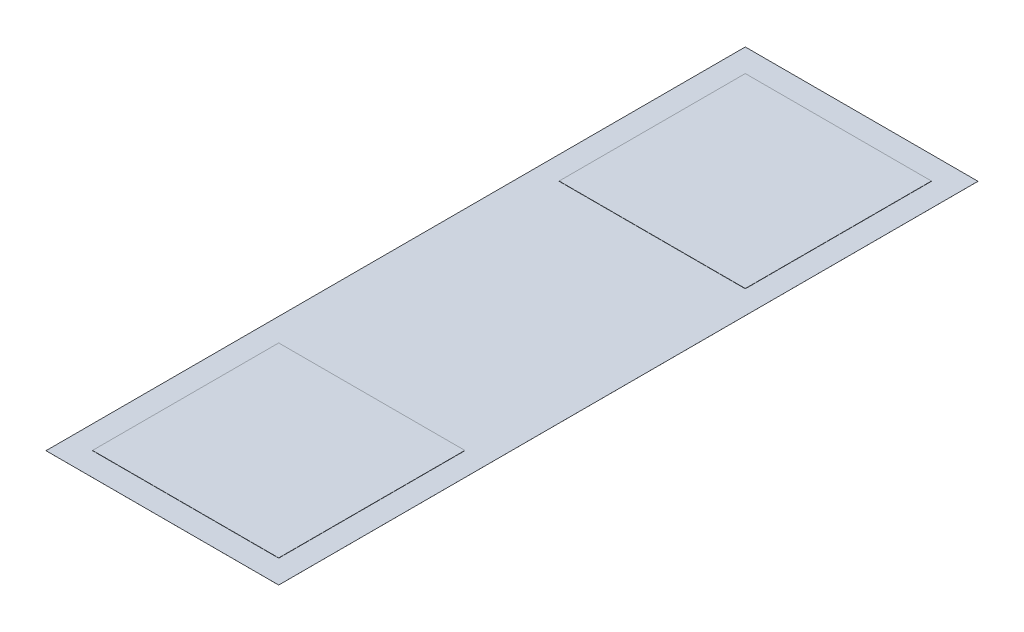
ISO-10303-21;
HEADER;
FILE_DESCRIPTION(('STEP AP214'),'2;1');
FILE_NAME('part.step','',(''),(''),'','','');
FILE_SCHEMA(('AUTOMOTIVE_DESIGN { 1 0 10303 214 1 1 1 1 }'));
ENDSEC;
DATA;
#1=APPLICATION_CONTEXT('core data for automotive mechanical design processes');
#2=APPLICATION_PROTOCOL_DEFINITION('international standard','automotive_design',2000,#1);
#3=PRODUCT_CONTEXT('',#1,'mechanical');
#4=PRODUCT('Part','Part','',(#3));
#5=PRODUCT_RELATED_PRODUCT_CATEGORY('part','',(#4));
#6=PRODUCT_DEFINITION_FORMATION('','',#4);
#7=PRODUCT_DEFINITION_CONTEXT('part definition',#1,'design');
#8=PRODUCT_DEFINITION('design','',#6,#7);
#9=PRODUCT_DEFINITION_SHAPE('','',#8);
#10=(LENGTH_UNIT() NAMED_UNIT(*) SI_UNIT(.MILLI.,.METRE.));
#11=(NAMED_UNIT(*) PLANE_ANGLE_UNIT() SI_UNIT($,.RADIAN.));
#12=(NAMED_UNIT(*) SI_UNIT($,.STERADIAN.) SOLID_ANGLE_UNIT());
#13=UNCERTAINTY_MEASURE_WITH_UNIT(LENGTH_MEASURE(1.E-05),#10,'distance_accuracy_value','');
#14=(GEOMETRIC_REPRESENTATION_CONTEXT(3) GLOBAL_UNCERTAINTY_ASSIGNED_CONTEXT((#13)) GLOBAL_UNIT_ASSIGNED_CONTEXT((#10,
#11,#12)) REPRESENTATION_CONTEXT('',''));
#15=CARTESIAN_POINT('',(0.,0.,0.));
#16=DIRECTION('',(0.,0.,1.));
#17=DIRECTION('',(1.,0.,0.));
#18=AXIS2_PLACEMENT_3D('',#15,#16,#17);
#19=CARTESIAN_POINT('',(0.,0.01,0.));
#20=DIRECTION('',(0.,1.,0.));
#21=DIRECTION('',(0.,0.,1.));
#22=AXIS2_PLACEMENT_3D('',#19,#20,#21);
#23=PLANE('',#22);
#24=DIRECTION('',(0.,0.,-1.));
#25=VECTOR('',#24,1.);
#26=CARTESIAN_POINT('',(50.,0.01,-150.255));
#27=LINE('',#26,#25);
#28=CARTESIAN_POINT('',(50.,0.01,150.255));
#29=VERTEX_POINT('',#28);
#30=CARTESIAN_POINT('',(50.,0.01,-150.255));
#31=VERTEX_POINT('',#30);
#32=EDGE_CURVE('E213',#29,#31,#27,.T.);
#33=ORIENTED_EDGE('',*,*,#32,.T.);
#34=DIRECTION('',(-1.,0.,0.));
#35=VECTOR('',#34,1.);
#36=CARTESIAN_POINT('',(-50.,0.01,-150.255));
#37=LINE('',#36,#35);
#38=CARTESIAN_POINT('',(-50.,0.01,-150.255));
#39=VERTEX_POINT('',#38);
#40=EDGE_CURVE('E217',#31,#39,#37,.T.);
#41=ORIENTED_EDGE('',*,*,#40,.T.);
#42=DIRECTION('',(0.,0.,1.));
#43=VECTOR('',#42,1.);
#44=CARTESIAN_POINT('',(-50.,0.01,-150.255));
#45=LINE('',#44,#43);
#46=CARTESIAN_POINT('',(-50.,0.01,150.255));
#47=VERTEX_POINT('',#46);
#48=EDGE_CURVE('E221',#39,#47,#45,.T.);
#49=ORIENTED_EDGE('',*,*,#48,.T.);
#50=DIRECTION('',(1.,0.,0.));
#51=VECTOR('',#50,1.);
#52=CARTESIAN_POINT('',(-50.,0.01,150.255));
#53=LINE('',#52,#51);
#54=EDGE_CURVE('E224',#47,#29,#53,.T.);
#55=ORIENTED_EDGE('',*,*,#54,.T.);
#56=EDGE_LOOP('',(#33,#41,#49,#55));
#57=FACE_BOUND('',#56,.T.);
#58=DIRECTION('',(1.,0.,0.));
#59=VECTOR('',#58,1.);
#60=CARTESIAN_POINT('',(-40.,0.01,-60.255));
#61=LINE('',#60,#59);
#62=CARTESIAN_POINT('',(-40.,0.01,-60.255));
#63=VERTEX_POINT('',#62);
#64=CARTESIAN_POINT('',(40.,0.01,-60.255));
#65=VERTEX_POINT('',#64);
#66=EDGE_CURVE('E195',#63,#65,#61,.T.);
#67=ORIENTED_EDGE('',*,*,#66,.F.);
#68=DIRECTION('',(0.,0.,1.));
#69=VECTOR('',#68,1.);
#70=CARTESIAN_POINT('',(-40.,0.01,-140.255));
#71=LINE('',#70,#69);
#72=CARTESIAN_POINT('',(-40.,0.01,-140.255));
#73=VERTEX_POINT('',#72);
#74=EDGE_CURVE('E198',#73,#63,#71,.T.);
#75=ORIENTED_EDGE('',*,*,#74,.F.);
#76=DIRECTION('',(-1.,0.,0.));
#77=VECTOR('',#76,1.);
#78=CARTESIAN_POINT('',(-40.,0.01,-140.255));
#79=LINE('',#78,#77);
#80=CARTESIAN_POINT('',(40.,0.01,-140.255));
#81=VERTEX_POINT('',#80);
#82=EDGE_CURVE('E188',#81,#73,#79,.T.);
#83=ORIENTED_EDGE('',*,*,#82,.F.);
#84=DIRECTION('',(0.,0.,-1.));
#85=VECTOR('',#84,1.);
#86=CARTESIAN_POINT('',(40.,0.01,-140.255));
#87=LINE('',#86,#85);
#88=EDGE_CURVE('E191',#65,#81,#87,.T.);
#89=ORIENTED_EDGE('',*,*,#88,.F.);
#90=EDGE_LOOP('',(#67,#75,#83,#89));
#91=FACE_BOUND('',#90,.T.);
#92=DIRECTION('',(1.,0.,0.));
#93=VECTOR('',#92,1.);
#94=CARTESIAN_POINT('',(-40.,0.01,140.255));
#95=LINE('',#94,#93);
#96=CARTESIAN_POINT('',(-40.,0.01,140.255));
#97=VERTEX_POINT('',#96);
#98=CARTESIAN_POINT('',(40.,0.01,140.255));
#99=VERTEX_POINT('',#98);
#100=EDGE_CURVE('E396',#97,#99,#95,.T.);
#101=ORIENTED_EDGE('',*,*,#100,.F.);
#102=DIRECTION('',(0.,0.,1.));
#103=VECTOR('',#102,1.);
#104=CARTESIAN_POINT('',(-40.,0.01,140.255));
#105=LINE('',#104,#103);
#106=CARTESIAN_POINT('',(-40.,0.01,60.255));
#107=VERTEX_POINT('',#106);
#108=EDGE_CURVE('E161',#107,#97,#105,.T.);
#109=ORIENTED_EDGE('',*,*,#108,.F.);
#110=DIRECTION('',(-1.,0.,0.));
#111=VECTOR('',#110,1.);
#112=CARTESIAN_POINT('',(-40.,0.01,60.255));
#113=LINE('',#112,#111);
#114=CARTESIAN_POINT('',(40.,0.01,60.255));
#115=VERTEX_POINT('',#114);
#116=EDGE_CURVE('E157',#115,#107,#113,.T.);
#117=ORIENTED_EDGE('',*,*,#116,.F.);
#118=DIRECTION('',(0.,0.,-1.));
#119=VECTOR('',#118,1.);
#120=CARTESIAN_POINT('',(40.,0.01,140.255));
#121=LINE('',#120,#119);
#122=EDGE_CURVE('E392',#99,#115,#121,.T.);
#123=ORIENTED_EDGE('',*,*,#122,.F.);
#124=EDGE_LOOP('',(#101,#109,#117,#123));
#125=FACE_BOUND('',#124,.T.);
#126=ADVANCED_FACE('F45',(#57,#91,#125),#23,.T.);
#127=CARTESIAN_POINT('',(50.,0.01,-150.255));
#128=DIRECTION('',(-1.,0.,0.));
#129=DIRECTION('',(0.,0.,1.));
#130=AXIS2_PLACEMENT_3D('',#127,#128,#129);
#131=PLANE('',#130);
#132=DIRECTION('',(0.,0.,-1.));
#133=VECTOR('',#132,1.);
#134=CARTESIAN_POINT('',(50.,0.,-150.255));
#135=LINE('',#134,#133);
#136=CARTESIAN_POINT('',(50.,0.,150.255));
#137=VERTEX_POINT('',#136);
#138=CARTESIAN_POINT('',(50.,0.,-150.255));
#139=VERTEX_POINT('',#138);
#140=EDGE_CURVE('E164',#137,#139,#135,.T.);
#141=ORIENTED_EDGE('',*,*,#140,.T.);
#142=DIRECTION('',(0.,-1.,0.));
#143=VECTOR('',#142,1.);
#144=CARTESIAN_POINT('',(50.,0.01,-150.255));
#145=LINE('',#144,#143);
#146=EDGE_CURVE('E11',#31,#139,#145,.T.);
#147=ORIENTED_EDGE('',*,*,#146,.F.);
#148=ORIENTED_EDGE('',*,*,#32,.F.);
#149=DIRECTION('',(0.,-1.,0.));
#150=VECTOR('',#149,1.);
#151=CARTESIAN_POINT('',(50.,0.01,150.255));
#152=LINE('',#151,#150);
#153=EDGE_CURVE('E226',#29,#137,#152,.T.);
#154=ORIENTED_EDGE('',*,*,#153,.T.);
#155=EDGE_LOOP('',(#141,#147,#148,#154));
#156=FACE_BOUND('',#155,.T.);
#157=ADVANCED_FACE('F47',(#156),#131,.F.);
#158=CARTESIAN_POINT('',(-50.,0.01,-150.255));
#159=DIRECTION('',(0.,0.,1.));
#160=DIRECTION('',(1.,0.,0.));
#161=AXIS2_PLACEMENT_3D('',#158,#159,#160);
#162=PLANE('',#161);
#163=DIRECTION('',(-1.,0.,0.));
#164=VECTOR('',#163,1.);
#165=CARTESIAN_POINT('',(-50.,0.,-150.255));
#166=LINE('',#165,#164);
#167=CARTESIAN_POINT('',(-50.,0.,-150.255));
#168=VERTEX_POINT('',#167);
#169=EDGE_CURVE('E169',#139,#168,#166,.T.);
#170=ORIENTED_EDGE('',*,*,#169,.T.);
#171=DIRECTION('',(0.,-1.,0.));
#172=VECTOR('',#171,1.);
#173=CARTESIAN_POINT('',(-50.,0.01,-150.255));
#174=LINE('',#173,#172);
#175=EDGE_CURVE('E54',#39,#168,#174,.T.);
#176=ORIENTED_EDGE('',*,*,#175,.F.);
#177=ORIENTED_EDGE('',*,*,#40,.F.);
#178=ORIENTED_EDGE('',*,*,#146,.T.);
#179=EDGE_LOOP('',(#170,#176,#177,#178));
#180=FACE_BOUND('',#179,.T.);
#181=ADVANCED_FACE('F263',(#180),#162,.F.);
#182=CARTESIAN_POINT('',(-50.,0.01,-150.255));
#183=DIRECTION('',(1.,0.,0.));
#184=DIRECTION('',(0.,0.,-1.));
#185=AXIS2_PLACEMENT_3D('',#182,#183,#184);
#186=PLANE('',#185);
#187=DIRECTION('',(0.,0.,1.));
#188=VECTOR('',#187,1.);
#189=CARTESIAN_POINT('',(-50.,0.,-150.255));
#190=LINE('',#189,#188);
#191=CARTESIAN_POINT('',(-50.,0.,150.255));
#192=VERTEX_POINT('',#191);
#193=EDGE_CURVE('E230',#168,#192,#190,.T.);
#194=ORIENTED_EDGE('',*,*,#193,.T.);
#195=DIRECTION('',(0.,-1.,0.));
#196=VECTOR('',#195,1.);
#197=CARTESIAN_POINT('',(-50.,0.01,150.255));
#198=LINE('',#197,#196);
#199=EDGE_CURVE('E238',#47,#192,#198,.T.);
#200=ORIENTED_EDGE('',*,*,#199,.F.);
#201=ORIENTED_EDGE('',*,*,#48,.F.);
#202=ORIENTED_EDGE('',*,*,#175,.T.);
#203=EDGE_LOOP('',(#194,#200,#201,#202));
#204=FACE_BOUND('',#203,.T.);
#205=ADVANCED_FACE('F247',(#204),#186,.F.);
#206=CARTESIAN_POINT('',(-50.,0.01,150.255));
#207=DIRECTION('',(0.,0.,-1.));
#208=DIRECTION('',(-1.,0.,0.));
#209=AXIS2_PLACEMENT_3D('',#206,#207,#208);
#210=PLANE('',#209);
#211=DIRECTION('',(1.,0.,0.));
#212=VECTOR('',#211,1.);
#213=CARTESIAN_POINT('',(-50.,0.,150.255));
#214=LINE('',#213,#212);
#215=EDGE_CURVE('E218',#192,#137,#214,.T.);
#216=ORIENTED_EDGE('',*,*,#215,.T.);
#217=ORIENTED_EDGE('',*,*,#153,.F.);
#218=ORIENTED_EDGE('',*,*,#54,.F.);
#219=ORIENTED_EDGE('',*,*,#199,.T.);
#220=EDGE_LOOP('',(#216,#217,#218,#219));
#221=FACE_BOUND('',#220,.T.);
#222=ADVANCED_FACE('F256',(#221),#210,.F.);
#223=CARTESIAN_POINT('',(0.,0.,0.));
#224=DIRECTION('',(0.,1.,0.));
#225=DIRECTION('',(0.,0.,1.));
#226=AXIS2_PLACEMENT_3D('',#223,#224,#225);
#227=PLANE('',#226);
#228=ORIENTED_EDGE('',*,*,#140,.F.);
#229=ORIENTED_EDGE('',*,*,#215,.F.);
#230=ORIENTED_EDGE('',*,*,#193,.F.);
#231=ORIENTED_EDGE('',*,*,#169,.F.);
#232=EDGE_LOOP('',(#228,#229,#230,#231));
#233=FACE_BOUND('',#232,.T.);
#234=ADVANCED_FACE('F253',(#233),#227,.F.);
#235=CARTESIAN_POINT('',(-40.,0.11,-140.255));
#236=DIRECTION('',(1.,0.,0.));
#237=DIRECTION('',(0.,0.,-1.));
#238=AXIS2_PLACEMENT_3D('',#235,#236,#237);
#239=PLANE('',#238);
#240=ORIENTED_EDGE('',*,*,#74,.T.);
#241=DIRECTION('',(0.,-1.,0.));
#242=VECTOR('',#241,1.);
#243=CARTESIAN_POINT('',(-40.,0.11,-60.255));
#244=LINE('',#243,#242);
#245=CARTESIAN_POINT('',(-40.,0.11,-60.255));
#246=VERTEX_POINT('',#245);
#247=EDGE_CURVE('E174',#246,#63,#244,.T.);
#248=ORIENTED_EDGE('',*,*,#247,.F.);
#249=DIRECTION('',(0.,0.,1.));
#250=VECTOR('',#249,1.);
#251=CARTESIAN_POINT('',(-40.,0.11,-140.255));
#252=LINE('',#251,#250);
#253=CARTESIAN_POINT('',(-40.,0.11,-140.255));
#254=VERTEX_POINT('',#253);
#255=EDGE_CURVE('E192',#254,#246,#252,.T.);
#256=ORIENTED_EDGE('',*,*,#255,.F.);
#257=DIRECTION('',(0.,-1.,0.));
#258=VECTOR('',#257,1.);
#259=CARTESIAN_POINT('',(-40.,0.11,-140.255));
#260=LINE('',#259,#258);
#261=EDGE_CURVE('E183',#254,#73,#260,.T.);
#262=ORIENTED_EDGE('',*,*,#261,.T.);
#263=EDGE_LOOP('',(#240,#248,#256,#262));
#264=FACE_BOUND('',#263,.T.);
#265=ADVANCED_FACE('F281',(#264),#239,.F.);
#266=CARTESIAN_POINT('',(-40.,0.11,-60.255));
#267=DIRECTION('',(0.,0.,-1.));
#268=DIRECTION('',(-1.,0.,0.));
#269=AXIS2_PLACEMENT_3D('',#266,#267,#268);
#270=PLANE('',#269);
#271=ORIENTED_EDGE('',*,*,#66,.T.);
#272=DIRECTION('',(0.,-1.,0.));
#273=VECTOR('',#272,1.);
#274=CARTESIAN_POINT('',(40.,0.11,-60.255));
#275=LINE('',#274,#273);
#276=CARTESIAN_POINT('',(40.,0.11,-60.255));
#277=VERTEX_POINT('',#276);
#278=EDGE_CURVE('E177',#277,#65,#275,.T.);
#279=ORIENTED_EDGE('',*,*,#278,.F.);
#280=DIRECTION('',(1.,0.,0.));
#281=VECTOR('',#280,1.);
#282=CARTESIAN_POINT('',(-40.,0.11,-60.255));
#283=LINE('',#282,#281);
#284=EDGE_CURVE('E207',#246,#277,#283,.T.);
#285=ORIENTED_EDGE('',*,*,#284,.F.);
#286=ORIENTED_EDGE('',*,*,#247,.T.);
#287=EDGE_LOOP('',(#271,#279,#285,#286));
#288=FACE_BOUND('',#287,.T.);
#289=ADVANCED_FACE('F305',(#288),#270,.F.);
#290=CARTESIAN_POINT('',(40.,0.11,-140.255));
#291=DIRECTION('',(-1.,0.,0.));
#292=DIRECTION('',(0.,0.,1.));
#293=AXIS2_PLACEMENT_3D('',#290,#291,#292);
#294=PLANE('',#293);
#295=ORIENTED_EDGE('',*,*,#88,.T.);
#296=DIRECTION('',(0.,-1.,0.));
#297=VECTOR('',#296,1.);
#298=CARTESIAN_POINT('',(40.,0.11,-140.255));
#299=LINE('',#298,#297);
#300=CARTESIAN_POINT('',(40.,0.11,-140.255));
#301=VERTEX_POINT('',#300);
#302=EDGE_CURVE('E69',#301,#81,#299,.T.);
#303=ORIENTED_EDGE('',*,*,#302,.F.);
#304=DIRECTION('',(0.,0.,-1.));
#305=VECTOR('',#304,1.);
#306=CARTESIAN_POINT('',(40.,0.11,-140.255));
#307=LINE('',#306,#305);
#308=EDGE_CURVE('E204',#277,#301,#307,.T.);
#309=ORIENTED_EDGE('',*,*,#308,.F.);
#310=ORIENTED_EDGE('',*,*,#278,.T.);
#311=EDGE_LOOP('',(#295,#303,#309,#310));
#312=FACE_BOUND('',#311,.T.);
#313=ADVANCED_FACE('F315',(#312),#294,.F.);
#314=CARTESIAN_POINT('',(-40.,0.11,-140.255));
#315=DIRECTION('',(0.,0.,1.));
#316=DIRECTION('',(1.,0.,0.));
#317=AXIS2_PLACEMENT_3D('',#314,#315,#316);
#318=PLANE('',#317);
#319=ORIENTED_EDGE('',*,*,#82,.T.);
#320=ORIENTED_EDGE('',*,*,#261,.F.);
#321=DIRECTION('',(-1.,0.,0.));
#322=VECTOR('',#321,1.);
#323=CARTESIAN_POINT('',(-40.,0.11,-140.255));
#324=LINE('',#323,#322);
#325=EDGE_CURVE('E187',#301,#254,#324,.T.);
#326=ORIENTED_EDGE('',*,*,#325,.F.);
#327=ORIENTED_EDGE('',*,*,#302,.T.);
#328=EDGE_LOOP('',(#319,#320,#326,#327));
#329=FACE_BOUND('',#328,.T.);
#330=ADVANCED_FACE('F325',(#329),#318,.F.);
#331=CARTESIAN_POINT('',(0.,0.11,0.));
#332=DIRECTION('',(0.,1.,0.));
#333=DIRECTION('',(0.,0.,1.));
#334=AXIS2_PLACEMENT_3D('',#331,#332,#333);
#335=PLANE('',#334);
#336=ORIENTED_EDGE('',*,*,#255,.T.);
#337=ORIENTED_EDGE('',*,*,#284,.T.);
#338=ORIENTED_EDGE('',*,*,#308,.T.);
#339=ORIENTED_EDGE('',*,*,#325,.T.);
#340=EDGE_LOOP('',(#336,#337,#338,#339));
#341=FACE_BOUND('',#340,.T.);
#342=ADVANCED_FACE('F278',(#341),#335,.T.);
#343=CARTESIAN_POINT('',(-40.,0.11,140.255));
#344=DIRECTION('',(1.,0.,0.));
#345=DIRECTION('',(0.,0.,-1.));
#346=AXIS2_PLACEMENT_3D('',#343,#344,#345);
#347=PLANE('',#346);
#348=ORIENTED_EDGE('',*,*,#108,.T.);
#349=DIRECTION('',(0.,-1.,0.));
#350=VECTOR('',#349,1.);
#351=CARTESIAN_POINT('',(-40.,0.11,140.255));
#352=LINE('',#351,#350);
#353=CARTESIAN_POINT('',(-40.,0.11,140.255));
#354=VERTEX_POINT('',#353);
#355=EDGE_CURVE('E140',#354,#97,#352,.T.);
#356=ORIENTED_EDGE('',*,*,#355,.F.);
#357=DIRECTION('',(0.,0.,1.));
#358=VECTOR('',#357,1.);
#359=CARTESIAN_POINT('',(-40.,0.11,140.255));
#360=LINE('',#359,#358);
#361=CARTESIAN_POINT('',(-40.,0.11,60.255));
#362=VERTEX_POINT('',#361);
#363=EDGE_CURVE('E148',#362,#354,#360,.T.);
#364=ORIENTED_EDGE('',*,*,#363,.F.);
#365=DIRECTION('',(0.,-1.,0.));
#366=VECTOR('',#365,1.);
#367=CARTESIAN_POINT('',(-40.,0.11,60.255));
#368=LINE('',#367,#366);
#369=EDGE_CURVE('E388',#362,#107,#368,.T.);
#370=ORIENTED_EDGE('',*,*,#369,.T.);
#371=EDGE_LOOP('',(#348,#356,#364,#370));
#372=FACE_BOUND('',#371,.T.);
#373=ADVANCED_FACE('F159',(#372),#347,.F.);
#374=CARTESIAN_POINT('',(-40.,0.11,140.255));
#375=DIRECTION('',(0.,0.,-1.));
#376=DIRECTION('',(-1.,0.,0.));
#377=AXIS2_PLACEMENT_3D('',#374,#375,#376);
#378=PLANE('',#377);
#379=ORIENTED_EDGE('',*,*,#100,.T.);
#380=DIRECTION('',(0.,-1.,0.));
#381=VECTOR('',#380,1.);
#382=CARTESIAN_POINT('',(40.,0.11,140.255));
#383=LINE('',#382,#381);
#384=CARTESIAN_POINT('',(40.,0.11,140.255));
#385=VERTEX_POINT('',#384);
#386=EDGE_CURVE('E143',#385,#99,#383,.T.);
#387=ORIENTED_EDGE('',*,*,#386,.F.);
#388=DIRECTION('',(1.,0.,0.));
#389=VECTOR('',#388,1.);
#390=CARTESIAN_POINT('',(-40.,0.11,140.255));
#391=LINE('',#390,#389);
#392=EDGE_CURVE('E136',#354,#385,#391,.T.);
#393=ORIENTED_EDGE('',*,*,#392,.F.);
#394=ORIENTED_EDGE('',*,*,#355,.T.);
#395=EDGE_LOOP('',(#379,#387,#393,#394));
#396=FACE_BOUND('',#395,.T.);
#397=ADVANCED_FACE('F138',(#396),#378,.F.);
#398=CARTESIAN_POINT('',(40.,0.11,140.255));
#399=DIRECTION('',(-1.,0.,0.));
#400=DIRECTION('',(0.,0.,1.));
#401=AXIS2_PLACEMENT_3D('',#398,#399,#400);
#402=PLANE('',#401);
#403=ORIENTED_EDGE('',*,*,#122,.T.);
#404=DIRECTION('',(0.,-1.,0.));
#405=VECTOR('',#404,1.);
#406=CARTESIAN_POINT('',(40.,0.11,60.255));
#407=LINE('',#406,#405);
#408=CARTESIAN_POINT('',(40.,0.11,60.255));
#409=VERTEX_POINT('',#408);
#410=EDGE_CURVE('E61',#409,#115,#407,.T.);
#411=ORIENTED_EDGE('',*,*,#410,.F.);
#412=DIRECTION('',(0.,0.,-1.));
#413=VECTOR('',#412,1.);
#414=CARTESIAN_POINT('',(40.,0.11,140.255));
#415=LINE('',#414,#413);
#416=EDGE_CURVE('E147',#385,#409,#415,.T.);
#417=ORIENTED_EDGE('',*,*,#416,.F.);
#418=ORIENTED_EDGE('',*,*,#386,.T.);
#419=EDGE_LOOP('',(#403,#411,#417,#418));
#420=FACE_BOUND('',#419,.T.);
#421=ADVANCED_FACE('F358',(#420),#402,.F.);
#422=CARTESIAN_POINT('',(-40.,0.11,60.255));
#423=DIRECTION('',(0.,0.,1.));
#424=DIRECTION('',(1.,0.,0.));
#425=AXIS2_PLACEMENT_3D('',#422,#423,#424);
#426=PLANE('',#425);
#427=ORIENTED_EDGE('',*,*,#116,.T.);
#428=ORIENTED_EDGE('',*,*,#369,.F.);
#429=DIRECTION('',(-1.,0.,0.));
#430=VECTOR('',#429,1.);
#431=CARTESIAN_POINT('',(-40.,0.11,60.255));
#432=LINE('',#431,#430);
#433=EDGE_CURVE('E152',#409,#362,#432,.T.);
#434=ORIENTED_EDGE('',*,*,#433,.F.);
#435=ORIENTED_EDGE('',*,*,#410,.T.);
#436=EDGE_LOOP('',(#427,#428,#434,#435));
#437=FACE_BOUND('',#436,.T.);
#438=ADVANCED_FACE('F367',(#437),#426,.F.);
#439=CARTESIAN_POINT('',(0.,0.11,0.));
#440=DIRECTION('',(0.,-1.,0.));
#441=DIRECTION('',(0.,0.,-1.));
#442=AXIS2_PLACEMENT_3D('',#439,#440,#441);
#443=PLANE('',#442);
#444=ORIENTED_EDGE('',*,*,#363,.T.);
#445=ORIENTED_EDGE('',*,*,#392,.T.);
#446=ORIENTED_EDGE('',*,*,#416,.T.);
#447=ORIENTED_EDGE('',*,*,#433,.T.);
#448=EDGE_LOOP('',(#444,#445,#446,#447));
#449=FACE_BOUND('',#448,.T.);
#450=ADVANCED_FACE('F151',(#449),#443,.F.);
#451=CLOSED_SHELL('',(#126,#157,#181,#205,#222,#234,#265,#289,#313,#330,#342,#373,#397,#421,
#438,#450));
#452=MANIFOLD_SOLID_BREP('B2',#451);
#453=ADVANCED_BREP_SHAPE_REPRESENTATION('',(#18,#452),#14);
#454=SHAPE_DEFINITION_REPRESENTATION(#9,#453);
ENDSEC;
END-ISO-10303-21;
